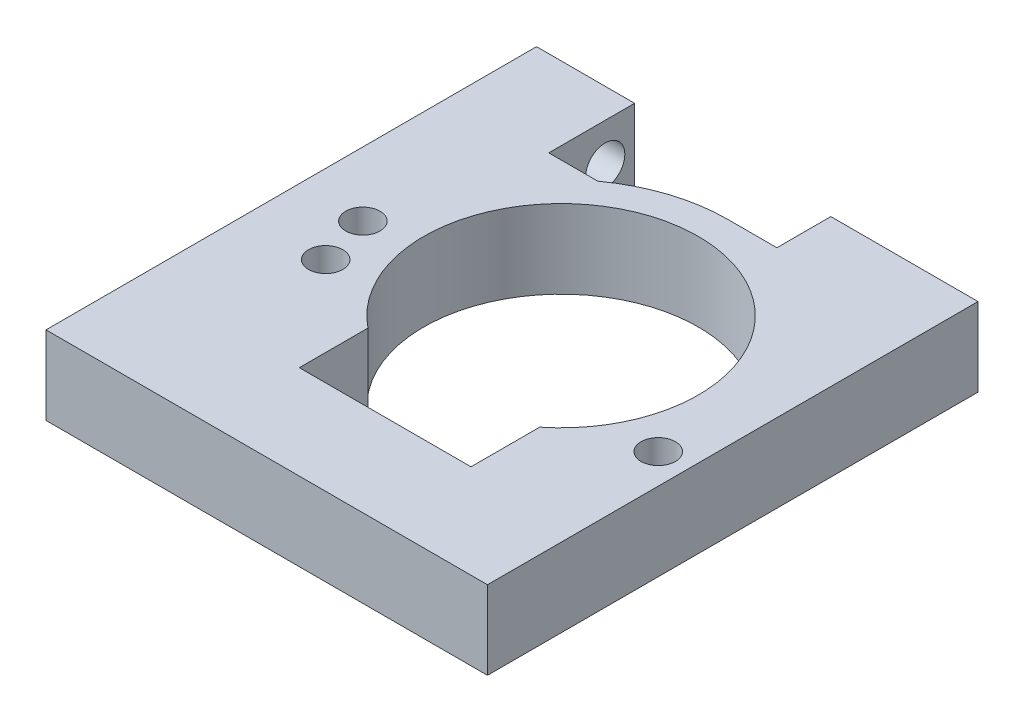
ISO-10303-21;
HEADER;
FILE_DESCRIPTION(('STEP AP214'),'2;1');
FILE_NAME('part.step','',(''),(''),'','','');
FILE_SCHEMA(('AUTOMOTIVE_DESIGN { 1 0 10303 214 1 1 1 1 }'));
ENDSEC;
DATA;
#1=APPLICATION_CONTEXT('core data for automotive mechanical design processes');
#2=APPLICATION_PROTOCOL_DEFINITION('international standard','automotive_design',2000,#1);
#3=PRODUCT_CONTEXT('',#1,'mechanical');
#4=PRODUCT('Part','Part','',(#3));
#5=PRODUCT_RELATED_PRODUCT_CATEGORY('part','',(#4));
#6=PRODUCT_DEFINITION_FORMATION('','',#4);
#7=PRODUCT_DEFINITION_CONTEXT('part definition',#1,'design');
#8=PRODUCT_DEFINITION('design','',#6,#7);
#9=PRODUCT_DEFINITION_SHAPE('','',#8);
#10=(LENGTH_UNIT() NAMED_UNIT(*) SI_UNIT(.MILLI.,.METRE.));
#11=(NAMED_UNIT(*) PLANE_ANGLE_UNIT() SI_UNIT($,.RADIAN.));
#12=(NAMED_UNIT(*) SI_UNIT($,.STERADIAN.) SOLID_ANGLE_UNIT());
#13=UNCERTAINTY_MEASURE_WITH_UNIT(LENGTH_MEASURE(1.E-05),#10,'distance_accuracy_value','');
#14=(GEOMETRIC_REPRESENTATION_CONTEXT(3) GLOBAL_UNCERTAINTY_ASSIGNED_CONTEXT((#13)) GLOBAL_UNIT_ASSIGNED_CONTEXT((#10,
#11,#12)) REPRESENTATION_CONTEXT('',''));
#15=CARTESIAN_POINT('',(0.,0.,0.));
#16=DIRECTION('',(0.,0.,1.));
#17=DIRECTION('',(1.,0.,0.));
#18=AXIS2_PLACEMENT_3D('',#15,#16,#17);
#19=CARTESIAN_POINT('',(-25.,-8.,-22.5));
#20=DIRECTION('',(0.,0.,-1.));
#21=DIRECTION('',(-1.,0.,0.));
#22=AXIS2_PLACEMENT_3D('',#19,#20,#21);
#23=PLANE('',#22);
#24=DIRECTION('',(0.,1.,0.));
#25=VECTOR('',#24,1.);
#26=CARTESIAN_POINT('',(-15.,-29.8312226222207,-22.5));
#27=LINE('',#26,#25);
#28=CARTESIAN_POINT('',(-15.,-8.,-22.5));
#29=VERTEX_POINT('',#28);
#30=CARTESIAN_POINT('',(-15.,0.,-22.5));
#31=VERTEX_POINT('',#30);
#32=EDGE_CURVE('E176',#29,#31,#27,.T.);
#33=ORIENTED_EDGE('',*,*,#32,.F.);
#34=DIRECTION('',(-1.,0.,0.));
#35=VECTOR('',#34,1.);
#36=CARTESIAN_POINT('',(-25.,-8.,-22.5));
#37=LINE('',#36,#35);
#38=CARTESIAN_POINT('',(-25.,-8.,-22.5));
#39=VERTEX_POINT('',#38);
#40=EDGE_CURVE('E237',#29,#39,#37,.T.);
#41=ORIENTED_EDGE('',*,*,#40,.T.);
#42=DIRECTION('',(0.,1.,0.));
#43=VECTOR('',#42,1.);
#44=CARTESIAN_POINT('',(-25.,-8.,-22.5));
#45=LINE('',#44,#43);
#46=CARTESIAN_POINT('',(-25.,0.,-22.5));
#47=VERTEX_POINT('',#46);
#48=EDGE_CURVE('E11',#39,#47,#45,.T.);
#49=ORIENTED_EDGE('',*,*,#48,.T.);
#50=DIRECTION('',(-1.,0.,0.));
#51=VECTOR('',#50,1.);
#52=CARTESIAN_POINT('',(-25.,0.,-22.5));
#53=LINE('',#52,#51);
#54=EDGE_CURVE('E248',#31,#47,#53,.T.);
#55=ORIENTED_EDGE('',*,*,#54,.F.);
#56=EDGE_LOOP('',(#33,#41,#49,#55));
#57=FACE_BOUND('',#56,.T.);
#58=ADVANCED_FACE('F35',(#57),#23,.T.);
#59=CARTESIAN_POINT('',(-25.,-8.,-22.5));
#60=DIRECTION('',(-1.,0.,0.));
#61=DIRECTION('',(0.,0.,1.));
#62=AXIS2_PLACEMENT_3D('',#59,#60,#61);
#63=PLANE('',#62);
#64=CARTESIAN_POINT('',(-25.,-4.,-19.5));
#65=DIRECTION('',(-1.,0.,0.));
#66=DIRECTION('',(0.,0.,1.));
#67=AXIS2_PLACEMENT_3D('',#64,#65,#66);
#68=CIRCLE('',#67,2.);
#69=CARTESIAN_POINT('',(-25.,-4.,-17.5));
#70=VERTEX_POINT('',#69);
#71=EDGE_CURVE('E281',#70,#70,#68,.F.);
#72=ORIENTED_EDGE('',*,*,#71,.T.);
#73=EDGE_LOOP('',(#72));
#74=FACE_BOUND('',#73,.T.);
#75=DIRECTION('',(0.,0.,1.));
#76=VECTOR('',#75,1.);
#77=CARTESIAN_POINT('',(-25.,0.,-22.5));
#78=LINE('',#77,#76);
#79=CARTESIAN_POINT('',(-25.,0.,27.5));
#80=VERTEX_POINT('',#79);
#81=EDGE_CURVE('E227',#47,#80,#78,.T.);
#82=ORIENTED_EDGE('',*,*,#81,.F.);
#83=ORIENTED_EDGE('',*,*,#48,.F.);
#84=DIRECTION('',(0.,0.,1.));
#85=VECTOR('',#84,1.);
#86=CARTESIAN_POINT('',(-25.,-8.,-22.5));
#87=LINE('',#86,#85);
#88=CARTESIAN_POINT('',(-25.,-8.,27.5));
#89=VERTEX_POINT('',#88);
#90=EDGE_CURVE('E228',#39,#89,#87,.T.);
#91=ORIENTED_EDGE('',*,*,#90,.T.);
#92=DIRECTION('',(0.,1.,0.));
#93=VECTOR('',#92,1.);
#94=CARTESIAN_POINT('',(-25.,-8.,27.5));
#95=LINE('',#94,#93);
#96=EDGE_CURVE('E39',#89,#80,#95,.T.);
#97=ORIENTED_EDGE('',*,*,#96,.T.);
#98=EDGE_LOOP('',(#82,#83,#91,#97));
#99=FACE_BOUND('',#98,.T.);
#100=ADVANCED_FACE('F37',(#74,#99),#63,.T.);
#101=DIRECTION('',(0.,1.,0.));
#102=VECTOR('',#101,1.);
#103=CARTESIAN_POINT('',(5.,-29.8312226222207,-22.5));
#104=LINE('',#103,#102);
#105=CARTESIAN_POINT('',(5.,-8.,-22.5));
#106=VERTEX_POINT('',#105);
#107=CARTESIAN_POINT('',(5.,0.,-22.5));
#108=VERTEX_POINT('',#107);
#109=EDGE_CURVE('E148',#106,#108,#104,.T.);
#110=ORIENTED_EDGE('',*,*,#109,.T.);
#111=CARTESIAN_POINT('',(20.,0.,-22.5));
#112=VERTEX_POINT('',#111);
#113=EDGE_CURVE('E162',#112,#108,#53,.T.);
#114=ORIENTED_EDGE('',*,*,#113,.F.);
#115=DIRECTION('',(0.,1.,0.));
#116=VECTOR('',#115,1.);
#117=CARTESIAN_POINT('',(20.,-8.,-22.5));
#118=LINE('',#117,#116);
#119=CARTESIAN_POINT('',(20.,-8.,-22.5));
#120=VERTEX_POINT('',#119);
#121=EDGE_CURVE('E44',#120,#112,#118,.T.);
#122=ORIENTED_EDGE('',*,*,#121,.F.);
#123=EDGE_CURVE('E238',#120,#106,#37,.T.);
#124=ORIENTED_EDGE('',*,*,#123,.T.);
#125=EDGE_LOOP('',(#110,#114,#122,#124));
#126=FACE_BOUND('',#125,.T.);
#127=ADVANCED_FACE('F274',(#126),#23,.T.);
#128=CARTESIAN_POINT('',(20.,-8.,-22.5));
#129=DIRECTION('',(1.,0.,0.));
#130=DIRECTION('',(0.,0.,-1.));
#131=AXIS2_PLACEMENT_3D('',#128,#129,#130);
#132=PLANE('',#131);
#133=DIRECTION('',(0.,0.,-1.));
#134=VECTOR('',#133,1.);
#135=CARTESIAN_POINT('',(20.,0.,-22.5));
#136=LINE('',#135,#134);
#137=CARTESIAN_POINT('',(20.,0.,27.5));
#138=VERTEX_POINT('',#137);
#139=EDGE_CURVE('E246',#138,#112,#136,.T.);
#140=ORIENTED_EDGE('',*,*,#139,.F.);
#141=DIRECTION('',(0.,1.,0.));
#142=VECTOR('',#141,1.);
#143=CARTESIAN_POINT('',(20.,-8.,27.5));
#144=LINE('',#143,#142);
#145=CARTESIAN_POINT('',(20.,-8.,27.5));
#146=VERTEX_POINT('',#145);
#147=EDGE_CURVE('E250',#146,#138,#144,.T.);
#148=ORIENTED_EDGE('',*,*,#147,.F.);
#149=DIRECTION('',(0.,0.,-1.));
#150=VECTOR('',#149,1.);
#151=CARTESIAN_POINT('',(20.,-8.,-22.5));
#152=LINE('',#151,#150);
#153=EDGE_CURVE('E234',#146,#120,#152,.T.);
#154=ORIENTED_EDGE('',*,*,#153,.T.);
#155=ORIENTED_EDGE('',*,*,#121,.T.);
#156=EDGE_LOOP('',(#140,#148,#154,#155));
#157=FACE_BOUND('',#156,.T.);
#158=ADVANCED_FACE('F272',(#157),#132,.T.);
#159=CARTESIAN_POINT('',(-25.,-8.,27.5));
#160=DIRECTION('',(0.,0.,1.));
#161=DIRECTION('',(1.,0.,0.));
#162=AXIS2_PLACEMENT_3D('',#159,#160,#161);
#163=PLANE('',#162);
#164=DIRECTION('',(1.,0.,0.));
#165=VECTOR('',#164,1.);
#166=CARTESIAN_POINT('',(-25.,0.,27.5));
#167=LINE('',#166,#165);
#168=EDGE_CURVE('E243',#80,#138,#167,.T.);
#169=ORIENTED_EDGE('',*,*,#168,.F.);
#170=ORIENTED_EDGE('',*,*,#96,.F.);
#171=DIRECTION('',(1.,0.,0.));
#172=VECTOR('',#171,1.);
#173=CARTESIAN_POINT('',(-25.,-8.,27.5));
#174=LINE('',#173,#172);
#175=EDGE_CURVE('E231',#89,#146,#174,.T.);
#176=ORIENTED_EDGE('',*,*,#175,.T.);
#177=ORIENTED_EDGE('',*,*,#147,.T.);
#178=EDGE_LOOP('',(#169,#170,#176,#177));
#179=FACE_BOUND('',#178,.T.);
#180=ADVANCED_FACE('F259',(#179),#163,.T.);
#181=CARTESIAN_POINT('',(0.,-8.,0.));
#182=DIRECTION('',(0.,1.,0.));
#183=DIRECTION('',(0.,0.,1.));
#184=AXIS2_PLACEMENT_3D('',#181,#182,#183);
#185=PLANE('',#184);
#186=ORIENTED_EDGE('',*,*,#40,.F.);
#187=DIRECTION('',(0.,0.,-1.));
#188=VECTOR('',#187,1.);
#189=CARTESIAN_POINT('',(-15.,-8.,-22.5));
#190=LINE('',#189,#188);
#191=CARTESIAN_POINT('',(-15.,-8.,-13.7477270848675));
#192=VERTEX_POINT('',#191);
#193=EDGE_CURVE('E276',#192,#29,#190,.T.);
#194=ORIENTED_EDGE('',*,*,#193,.F.);
#195=DIRECTION('',(-1.,0.,0.));
#196=VECTOR('',#195,1.);
#197=CARTESIAN_POINT('',(-15.,-8.,-13.7477270848675));
#198=LINE('',#197,#196);
#199=CARTESIAN_POINT('',(-10.,-8.,-13.7477270848675));
#200=VERTEX_POINT('',#199);
#201=EDGE_CURVE('E278',#200,#192,#198,.T.);
#202=ORIENTED_EDGE('',*,*,#201,.F.);
#203=CARTESIAN_POINT('',(0.,-8.,0.));
#204=DIRECTION('',(0.,1.,0.));
#205=DIRECTION('',(0.,0.,1.));
#206=AXIS2_PLACEMENT_3D('',#203,#204,#205);
#207=CIRCLE('',#206,17.);
#208=CARTESIAN_POINT('',(0.,-8.,-17.));
#209=VERTEX_POINT('',#208);
#210=EDGE_CURVE('E183',#209,#200,#207,.T.);
#211=ORIENTED_EDGE('',*,*,#210,.F.);
#212=DIRECTION('',(-1.,0.,0.));
#213=VECTOR('',#212,1.);
#214=CARTESIAN_POINT('',(0.,-8.,-17.));
#215=LINE('',#214,#213);
#216=CARTESIAN_POINT('',(5.,-8.00000000000001,-17.));
#217=VERTEX_POINT('',#216);
#218=EDGE_CURVE('E180',#217,#209,#215,.T.);
#219=ORIENTED_EDGE('',*,*,#218,.F.);
#220=DIRECTION('',(0.,0.,1.));
#221=VECTOR('',#220,1.);
#222=CARTESIAN_POINT('',(5.,-8.,-17.));
#223=LINE('',#222,#221);
#224=EDGE_CURVE('E145',#106,#217,#223,.T.);
#225=ORIENTED_EDGE('',*,*,#224,.F.);
#226=ORIENTED_EDGE('',*,*,#123,.F.);
#227=ORIENTED_EDGE('',*,*,#153,.F.);
#228=ORIENTED_EDGE('',*,*,#175,.F.);
#229=ORIENTED_EDGE('',*,*,#90,.F.);
#230=EDGE_LOOP('',(#186,#194,#202,#211,#219,#225,#226,#227,#228,#229));
#231=FACE_BOUND('',#230,.T.);
#232=CARTESIAN_POINT('',(-16.95,-8.,7.04150262212918));
#233=DIRECTION('',(0.,1.,0.));
#234=DIRECTION('',(0.,0.,1.));
#235=AXIS2_PLACEMENT_3D('',#232,#233,#234);
#236=CIRCLE('',#235,1.75);
#237=CARTESIAN_POINT('',(-16.95,-8.,8.79150262212918));
#238=VERTEX_POINT('',#237);
#239=EDGE_CURVE('E186',#238,#238,#236,.F.);
#240=ORIENTED_EDGE('',*,*,#239,.F.);
#241=EDGE_LOOP('',(#240));
#242=FACE_BOUND('',#241,.T.);
#243=CARTESIAN_POINT('',(16.95,-8.,7.04150262212918));
#244=DIRECTION('',(0.,1.,0.));
#245=DIRECTION('',(0.,0.,1.));
#246=AXIS2_PLACEMENT_3D('',#243,#244,#245);
#247=CIRCLE('',#246,1.75);
#248=CARTESIAN_POINT('',(16.95,-8.,8.79150262212918));
#249=VERTEX_POINT('',#248);
#250=EDGE_CURVE('E192',#249,#249,#247,.F.);
#251=ORIENTED_EDGE('',*,*,#250,.F.);
#252=EDGE_LOOP('',(#251));
#253=FACE_BOUND('',#252,.T.);
#254=CARTESIAN_POINT('',(-18.45,-8.,1.75));
#255=DIRECTION('',(0.,1.,0.));
#256=DIRECTION('',(0.,0.,1.));
#257=AXIS2_PLACEMENT_3D('',#254,#255,#256);
#258=CIRCLE('',#257,1.75);
#259=CARTESIAN_POINT('',(-18.45,-8.,3.5));
#260=VERTEX_POINT('',#259);
#261=EDGE_CURVE('E198',#260,#260,#258,.F.);
#262=ORIENTED_EDGE('',*,*,#261,.F.);
#263=EDGE_LOOP('',(#262));
#264=FACE_BOUND('',#263,.T.);
#265=DIRECTION('',(0.,0.,1.));
#266=VECTOR('',#265,1.);
#267=CARTESIAN_POINT('',(8.75,-8.,17.9287464971972));
#268=LINE('',#267,#266);
#269=CARTESIAN_POINT('',(8.75,-8.,10.9287464971972));
#270=VERTEX_POINT('',#269);
#271=CARTESIAN_POINT('',(8.75,-8.,17.9287464971972));
#272=VERTEX_POINT('',#271);
#273=EDGE_CURVE('E204',#270,#272,#268,.T.);
#274=ORIENTED_EDGE('',*,*,#273,.F.);
#275=CARTESIAN_POINT('',(0.,-8.,0.));
#276=DIRECTION('',(0.,1.,0.));
#277=DIRECTION('',(0.,0.,1.));
#278=AXIS2_PLACEMENT_3D('',#275,#276,#277);
#279=CIRCLE('',#278,14.);
#280=CARTESIAN_POINT('',(-8.75,-8.,10.9287464971972));
#281=VERTEX_POINT('',#280);
#282=EDGE_CURVE('E207',#281,#270,#279,.F.);
#283=ORIENTED_EDGE('',*,*,#282,.F.);
#284=DIRECTION('',(0.,0.,-1.));
#285=VECTOR('',#284,1.);
#286=CARTESIAN_POINT('',(-8.75,-8.,17.9287464971972));
#287=LINE('',#286,#285);
#288=CARTESIAN_POINT('',(-8.75,-8.,17.9287464971972));
#289=VERTEX_POINT('',#288);
#290=EDGE_CURVE('E209',#289,#281,#287,.T.);
#291=ORIENTED_EDGE('',*,*,#290,.F.);
#292=DIRECTION('',(-1.,0.,0.));
#293=VECTOR('',#292,1.);
#294=CARTESIAN_POINT('',(-8.75,-8.,17.9287464971972));
#295=LINE('',#294,#293);
#296=EDGE_CURVE('E202',#272,#289,#295,.T.);
#297=ORIENTED_EDGE('',*,*,#296,.F.);
#298=EDGE_LOOP('',(#274,#283,#291,#297));
#299=FACE_BOUND('',#298,.T.);
#300=ADVANCED_FACE('F266',(#231,#242,#253,#264,#299),#185,.F.);
#301=CARTESIAN_POINT('',(0.,0.,0.));
#302=DIRECTION('',(0.,1.,0.));
#303=DIRECTION('',(0.,0.,1.));
#304=AXIS2_PLACEMENT_3D('',#301,#302,#303);
#305=PLANE('',#304);
#306=DIRECTION('',(0.,0.,1.));
#307=VECTOR('',#306,1.);
#308=CARTESIAN_POINT('',(-15.,0.,-22.5));
#309=LINE('',#308,#307);
#310=CARTESIAN_POINT('',(-15.,0.,-13.7477270848675));
#311=VERTEX_POINT('',#310);
#312=EDGE_CURVE('E163',#31,#311,#309,.T.);
#313=ORIENTED_EDGE('',*,*,#312,.F.);
#314=ORIENTED_EDGE('',*,*,#54,.T.);
#315=ORIENTED_EDGE('',*,*,#81,.T.);
#316=ORIENTED_EDGE('',*,*,#168,.T.);
#317=ORIENTED_EDGE('',*,*,#139,.T.);
#318=ORIENTED_EDGE('',*,*,#113,.T.);
#319=DIRECTION('',(0.,0.,-1.));
#320=VECTOR('',#319,1.);
#321=CARTESIAN_POINT('',(5.,0.,-17.));
#322=LINE('',#321,#320);
#323=CARTESIAN_POINT('',(5.,0.,-17.));
#324=VERTEX_POINT('',#323);
#325=EDGE_CURVE('E142',#324,#108,#322,.T.);
#326=ORIENTED_EDGE('',*,*,#325,.F.);
#327=DIRECTION('',(1.,0.,0.));
#328=VECTOR('',#327,1.);
#329=CARTESIAN_POINT('',(0.,0.,-17.));
#330=LINE('',#329,#328);
#331=CARTESIAN_POINT('',(0.,0.,-17.));
#332=VERTEX_POINT('',#331);
#333=EDGE_CURVE('E152',#332,#324,#330,.T.);
#334=ORIENTED_EDGE('',*,*,#333,.F.);
#335=CARTESIAN_POINT('',(0.,0.,0.));
#336=DIRECTION('',(0.,-1.,0.));
#337=DIRECTION('',(0.,0.,-1.));
#338=AXIS2_PLACEMENT_3D('',#335,#336,#337);
#339=CIRCLE('',#338,17.);
#340=CARTESIAN_POINT('',(-10.,0.,-13.7477270848675));
#341=VERTEX_POINT('',#340);
#342=EDGE_CURVE('E52',#341,#332,#339,.T.);
#343=ORIENTED_EDGE('',*,*,#342,.F.);
#344=DIRECTION('',(1.,0.,0.));
#345=VECTOR('',#344,1.);
#346=CARTESIAN_POINT('',(-15.,0.,-13.7477270848675));
#347=LINE('',#346,#345);
#348=EDGE_CURVE('E166',#311,#341,#347,.T.);
#349=ORIENTED_EDGE('',*,*,#348,.F.);
#350=EDGE_LOOP('',(#313,#314,#315,#316,#317,#318,#326,#334,#343,#349));
#351=FACE_BOUND('',#350,.T.);
#352=CARTESIAN_POINT('',(-16.95,0.,7.04150262212918));
#353=DIRECTION('',(0.,1.,0.));
#354=DIRECTION('',(0.,0.,1.));
#355=AXIS2_PLACEMENT_3D('',#352,#353,#354);
#356=CIRCLE('',#355,1.75);
#357=CARTESIAN_POINT('',(-16.95,0.,8.79150262212918));
#358=VERTEX_POINT('',#357);
#359=EDGE_CURVE('E182',#358,#358,#356,.T.);
#360=ORIENTED_EDGE('',*,*,#359,.F.);
#361=EDGE_LOOP('',(#360));
#362=FACE_BOUND('',#361,.T.);
#363=CARTESIAN_POINT('',(16.95,0.,7.04150262212918));
#364=DIRECTION('',(0.,1.,0.));
#365=DIRECTION('',(0.,0.,1.));
#366=AXIS2_PLACEMENT_3D('',#363,#364,#365);
#367=CIRCLE('',#366,1.75);
#368=CARTESIAN_POINT('',(16.95,0.,8.79150262212918));
#369=VERTEX_POINT('',#368);
#370=EDGE_CURVE('E189',#369,#369,#367,.T.);
#371=ORIENTED_EDGE('',*,*,#370,.F.);
#372=EDGE_LOOP('',(#371));
#373=FACE_BOUND('',#372,.T.);
#374=CARTESIAN_POINT('',(-18.45,0.,1.75));
#375=DIRECTION('',(0.,1.,0.));
#376=DIRECTION('',(0.,0.,1.));
#377=AXIS2_PLACEMENT_3D('',#374,#375,#376);
#378=CIRCLE('',#377,1.75);
#379=CARTESIAN_POINT('',(-18.45,0.,3.5));
#380=VERTEX_POINT('',#379);
#381=EDGE_CURVE('E195',#380,#380,#378,.T.);
#382=ORIENTED_EDGE('',*,*,#381,.F.);
#383=EDGE_LOOP('',(#382));
#384=FACE_BOUND('',#383,.T.);
#385=CARTESIAN_POINT('',(0.,0.,0.));
#386=DIRECTION('',(0.,1.,0.));
#387=DIRECTION('',(0.,0.,1.));
#388=AXIS2_PLACEMENT_3D('',#385,#386,#387);
#389=CIRCLE('',#388,14.);
#390=CARTESIAN_POINT('',(8.75,0.,10.9287464971972));
#391=VERTEX_POINT('',#390);
#392=CARTESIAN_POINT('',(-8.75,0.,10.9287464971972));
#393=VERTEX_POINT('',#392);
#394=EDGE_CURVE('E201',#391,#393,#389,.T.);
#395=ORIENTED_EDGE('',*,*,#394,.F.);
#396=DIRECTION('',(0.,0.,-1.));
#397=VECTOR('',#396,1.);
#398=CARTESIAN_POINT('',(8.75,0.,17.9287464971972));
#399=LINE('',#398,#397);
#400=CARTESIAN_POINT('',(8.75,0.,17.9287464971972));
#401=VERTEX_POINT('',#400);
#402=EDGE_CURVE('E216',#401,#391,#399,.T.);
#403=ORIENTED_EDGE('',*,*,#402,.F.);
#404=DIRECTION('',(1.,0.,0.));
#405=VECTOR('',#404,1.);
#406=CARTESIAN_POINT('',(-8.75,0.,17.9287464971972));
#407=LINE('',#406,#405);
#408=CARTESIAN_POINT('',(-8.75,0.,17.9287464971972));
#409=VERTEX_POINT('',#408);
#410=EDGE_CURVE('E213',#409,#401,#407,.T.);
#411=ORIENTED_EDGE('',*,*,#410,.F.);
#412=DIRECTION('',(0.,0.,1.));
#413=VECTOR('',#412,1.);
#414=CARTESIAN_POINT('',(-8.75,0.,17.9287464971972));
#415=LINE('',#414,#413);
#416=EDGE_CURVE('E211',#393,#409,#415,.T.);
#417=ORIENTED_EDGE('',*,*,#416,.F.);
#418=EDGE_LOOP('',(#395,#403,#411,#417));
#419=FACE_BOUND('',#418,.T.);
#420=ADVANCED_FACE('F158',(#351,#362,#373,#384,#419),#305,.T.);
#421=CARTESIAN_POINT('',(0.,-50.4669854461355,0.));
#422=DIRECTION('',(0.,1.,0.));
#423=DIRECTION('',(0.,0.,1.));
#424=AXIS2_PLACEMENT_3D('',#421,#422,#423);
#425=CYLINDRICAL_SURFACE('',#424,14.);
#426=ORIENTED_EDGE('',*,*,#282,.T.);
#427=DIRECTION('',(0.,1.,0.));
#428=VECTOR('',#427,1.);
#429=CARTESIAN_POINT('',(8.75,-50.4669854461355,10.9287464971972));
#430=LINE('',#429,#428);
#431=EDGE_CURVE('E205',#270,#391,#430,.T.);
#432=ORIENTED_EDGE('',*,*,#431,.T.);
#433=ORIENTED_EDGE('',*,*,#394,.T.);
#434=DIRECTION('',(0.,1.,0.));
#435=VECTOR('',#434,1.);
#436=CARTESIAN_POINT('',(-8.75,-50.4669854461355,10.9287464971972));
#437=LINE('',#436,#435);
#438=EDGE_CURVE('E219',#281,#393,#437,.T.);
#439=ORIENTED_EDGE('',*,*,#438,.F.);
#440=EDGE_LOOP('',(#426,#432,#433,#439));
#441=FACE_BOUND('',#440,.T.);
#442=ADVANCED_FACE('F338',(#441),#425,.F.);
#443=CARTESIAN_POINT('',(8.75,-50.4669854461355,17.9287464971972));
#444=DIRECTION('',(1.,0.,0.));
#445=DIRECTION('',(0.,0.,-1.));
#446=AXIS2_PLACEMENT_3D('',#443,#444,#445);
#447=PLANE('',#446);
#448=ORIENTED_EDGE('',*,*,#273,.T.);
#449=DIRECTION('',(0.,1.,0.));
#450=VECTOR('',#449,1.);
#451=CARTESIAN_POINT('',(8.75,-50.4669854461355,17.9287464971972));
#452=LINE('',#451,#450);
#453=EDGE_CURVE('E221',#272,#401,#452,.T.);
#454=ORIENTED_EDGE('',*,*,#453,.T.);
#455=ORIENTED_EDGE('',*,*,#402,.T.);
#456=ORIENTED_EDGE('',*,*,#431,.F.);
#457=EDGE_LOOP('',(#448,#454,#455,#456));
#458=FACE_BOUND('',#457,.T.);
#459=ADVANCED_FACE('F342',(#458),#447,.F.);
#460=CARTESIAN_POINT('',(-8.75,-50.4669854461355,17.9287464971972));
#461=DIRECTION('',(0.,0.,1.));
#462=DIRECTION('',(1.,0.,0.));
#463=AXIS2_PLACEMENT_3D('',#460,#461,#462);
#464=PLANE('',#463);
#465=ORIENTED_EDGE('',*,*,#296,.T.);
#466=DIRECTION('',(0.,1.,0.));
#467=VECTOR('',#466,1.);
#468=CARTESIAN_POINT('',(-8.75,-50.4669854461355,17.9287464971972));
#469=LINE('',#468,#467);
#470=EDGE_CURVE('E60',#289,#409,#469,.T.);
#471=ORIENTED_EDGE('',*,*,#470,.T.);
#472=ORIENTED_EDGE('',*,*,#410,.T.);
#473=ORIENTED_EDGE('',*,*,#453,.F.);
#474=EDGE_LOOP('',(#465,#471,#472,#473));
#475=FACE_BOUND('',#474,.T.);
#476=ADVANCED_FACE('F348',(#475),#464,.F.);
#477=CARTESIAN_POINT('',(-8.75,-50.4669854461355,17.9287464971972));
#478=DIRECTION('',(-1.,0.,0.));
#479=DIRECTION('',(0.,0.,1.));
#480=AXIS2_PLACEMENT_3D('',#477,#478,#479);
#481=PLANE('',#480);
#482=ORIENTED_EDGE('',*,*,#290,.T.);
#483=ORIENTED_EDGE('',*,*,#438,.T.);
#484=ORIENTED_EDGE('',*,*,#416,.T.);
#485=ORIENTED_EDGE('',*,*,#470,.F.);
#486=EDGE_LOOP('',(#482,#483,#484,#485));
#487=FACE_BOUND('',#486,.T.);
#488=ADVANCED_FACE('F344',(#487),#481,.F.);
#489=CARTESIAN_POINT('',(-18.45,-50.4669854461355,1.75));
#490=DIRECTION('',(0.,1.,0.));
#491=DIRECTION('',(0.,0.,1.));
#492=AXIS2_PLACEMENT_3D('',#489,#490,#491);
#493=CYLINDRICAL_SURFACE('',#492,1.75);
#494=ORIENTED_EDGE('',*,*,#261,.T.);
#495=EDGE_LOOP('',(#494));
#496=FACE_BOUND('',#495,.T.);
#497=ORIENTED_EDGE('',*,*,#381,.T.);
#498=EDGE_LOOP('',(#497));
#499=FACE_BOUND('',#498,.T.);
#500=ADVANCED_FACE('F347',(#496,#499),#493,.F.);
#501=CARTESIAN_POINT('',(16.95,-50.4669854461355,7.04150262212918));
#502=DIRECTION('',(0.,1.,0.));
#503=DIRECTION('',(0.,0.,1.));
#504=AXIS2_PLACEMENT_3D('',#501,#502,#503);
#505=CYLINDRICAL_SURFACE('',#504,1.75);
#506=ORIENTED_EDGE('',*,*,#250,.T.);
#507=EDGE_LOOP('',(#506));
#508=FACE_BOUND('',#507,.T.);
#509=ORIENTED_EDGE('',*,*,#370,.T.);
#510=EDGE_LOOP('',(#509));
#511=FACE_BOUND('',#510,.T.);
#512=ADVANCED_FACE('F313',(#508,#511),#505,.F.);
#513=CARTESIAN_POINT('',(-16.95,-50.4669854461355,7.04150262212918));
#514=DIRECTION('',(0.,1.,0.));
#515=DIRECTION('',(0.,0.,1.));
#516=AXIS2_PLACEMENT_3D('',#513,#514,#515);
#517=CYLINDRICAL_SURFACE('',#516,1.75);
#518=ORIENTED_EDGE('',*,*,#239,.T.);
#519=EDGE_LOOP('',(#518));
#520=FACE_BOUND('',#519,.T.);
#521=ORIENTED_EDGE('',*,*,#359,.T.);
#522=EDGE_LOOP('',(#521));
#523=FACE_BOUND('',#522,.T.);
#524=ADVANCED_FACE('F306',(#520,#523),#517,.F.);
#525=CARTESIAN_POINT('',(0.,-29.8312226222207,0.));
#526=DIRECTION('',(0.,1.,0.));
#527=DIRECTION('',(0.,0.,1.));
#528=AXIS2_PLACEMENT_3D('',#525,#526,#527);
#529=CYLINDRICAL_SURFACE('',#528,17.);
#530=ORIENTED_EDGE('',*,*,#210,.T.);
#531=DIRECTION('',(0.,1.,0.));
#532=VECTOR('',#531,1.);
#533=CARTESIAN_POINT('',(-10.,-29.8312226222207,-13.7477270848675));
#534=LINE('',#533,#532);
#535=EDGE_CURVE('E172',#200,#341,#534,.T.);
#536=ORIENTED_EDGE('',*,*,#535,.T.);
#537=ORIENTED_EDGE('',*,*,#342,.T.);
#538=DIRECTION('',(0.,1.,0.));
#539=VECTOR('',#538,1.);
#540=CARTESIAN_POINT('',(0.,-29.8312226222207,-17.));
#541=LINE('',#540,#539);
#542=EDGE_CURVE('E149',#209,#332,#541,.T.);
#543=ORIENTED_EDGE('',*,*,#542,.F.);
#544=EDGE_LOOP('',(#530,#536,#537,#543));
#545=FACE_BOUND('',#544,.T.);
#546=ADVANCED_FACE('F304',(#545),#529,.T.);
#547=CARTESIAN_POINT('',(-15.,-29.8312226222207,-13.7477270848675));
#548=DIRECTION('',(0.,0.,1.));
#549=DIRECTION('',(1.,0.,0.));
#550=AXIS2_PLACEMENT_3D('',#547,#548,#549);
#551=PLANE('',#550);
#552=ORIENTED_EDGE('',*,*,#201,.T.);
#553=DIRECTION('',(0.,1.,0.));
#554=VECTOR('',#553,1.);
#555=CARTESIAN_POINT('',(-15.,-29.8312226222207,-13.7477270848675));
#556=LINE('',#555,#554);
#557=EDGE_CURVE('E174',#192,#311,#556,.T.);
#558=ORIENTED_EDGE('',*,*,#557,.T.);
#559=ORIENTED_EDGE('',*,*,#348,.T.);
#560=ORIENTED_EDGE('',*,*,#535,.F.);
#561=EDGE_LOOP('',(#552,#558,#559,#560));
#562=FACE_BOUND('',#561,.T.);
#563=ADVANCED_FACE('F298',(#562),#551,.F.);
#564=CARTESIAN_POINT('',(-15.,-29.8312226222207,-22.5));
#565=DIRECTION('',(-1.,0.,0.));
#566=DIRECTION('',(0.,0.,1.));
#567=AXIS2_PLACEMENT_3D('',#564,#565,#566);
#568=PLANE('',#567);
#569=CARTESIAN_POINT('',(-15.,-4.,-19.5));
#570=DIRECTION('',(1.,0.,0.));
#571=DIRECTION('',(0.,0.,-1.));
#572=AXIS2_PLACEMENT_3D('',#569,#570,#571);
#573=CIRCLE('',#572,2.);
#574=CARTESIAN_POINT('',(-15.,-4.,-21.5));
#575=VERTEX_POINT('',#574);
#576=EDGE_CURVE('E286',#575,#575,#573,.T.);
#577=ORIENTED_EDGE('',*,*,#576,.F.);
#578=EDGE_LOOP('',(#577));
#579=FACE_BOUND('',#578,.T.);
#580=ORIENTED_EDGE('',*,*,#193,.T.);
#581=ORIENTED_EDGE('',*,*,#32,.T.);
#582=ORIENTED_EDGE('',*,*,#312,.T.);
#583=ORIENTED_EDGE('',*,*,#557,.F.);
#584=EDGE_LOOP('',(#580,#581,#582,#583));
#585=FACE_BOUND('',#584,.T.);
#586=ADVANCED_FACE('F295',(#579,#585),#568,.F.);
#587=CARTESIAN_POINT('',(5.,-29.8312226222207,-17.));
#588=DIRECTION('',(1.,0.,0.));
#589=DIRECTION('',(0.,0.,-1.));
#590=AXIS2_PLACEMENT_3D('',#587,#588,#589);
#591=PLANE('',#590);
#592=ORIENTED_EDGE('',*,*,#224,.T.);
#593=DIRECTION('',(0.,1.,0.));
#594=VECTOR('',#593,1.);
#595=CARTESIAN_POINT('',(5.,-29.8312226222207,-17.));
#596=LINE('',#595,#594);
#597=EDGE_CURVE('E138',#217,#324,#596,.T.);
#598=ORIENTED_EDGE('',*,*,#597,.T.);
#599=ORIENTED_EDGE('',*,*,#325,.T.);
#600=ORIENTED_EDGE('',*,*,#109,.F.);
#601=EDGE_LOOP('',(#592,#598,#599,#600));
#602=FACE_BOUND('',#601,.T.);
#603=ADVANCED_FACE('F140',(#602),#591,.F.);
#604=CARTESIAN_POINT('',(0.,-29.8312226222207,-17.));
#605=DIRECTION('',(0.,0.,1.));
#606=DIRECTION('',(1.,0.,0.));
#607=AXIS2_PLACEMENT_3D('',#604,#605,#606);
#608=PLANE('',#607);
#609=ORIENTED_EDGE('',*,*,#218,.T.);
#610=ORIENTED_EDGE('',*,*,#542,.T.);
#611=ORIENTED_EDGE('',*,*,#333,.T.);
#612=ORIENTED_EDGE('',*,*,#597,.F.);
#613=EDGE_LOOP('',(#609,#610,#611,#612));
#614=FACE_BOUND('',#613,.T.);
#615=ADVANCED_FACE('F153',(#614),#608,.F.);
#616=CARTESIAN_POINT('',(-30.6568542494924,-4.,-19.5));
#617=DIRECTION('',(1.,0.,0.));
#618=DIRECTION('',(0.,0.,-1.));
#619=AXIS2_PLACEMENT_3D('',#616,#617,#618);
#620=CYLINDRICAL_SURFACE('',#619,2.);
#621=ORIENTED_EDGE('',*,*,#576,.T.);
#622=EDGE_LOOP('',(#621));
#623=FACE_BOUND('',#622,.T.);
#624=ORIENTED_EDGE('',*,*,#71,.F.);
#625=EDGE_LOOP('',(#624));
#626=FACE_BOUND('',#625,.T.);
#627=ADVANCED_FACE('F292',(#623,#626),#620,.F.);
#628=CLOSED_SHELL('',(#58,#100,#127,#158,#180,#300,#420,#442,#459,#476,#488,#500,#512,#524,#546,
#563,#586,#603,#615,#627));
#629=MANIFOLD_SOLID_BREP('B2',#628);
#630=ADVANCED_BREP_SHAPE_REPRESENTATION('',(#18,#629),#14);
#631=SHAPE_DEFINITION_REPRESENTATION(#9,#630);
ENDSEC;
END-ISO-10303-21;
